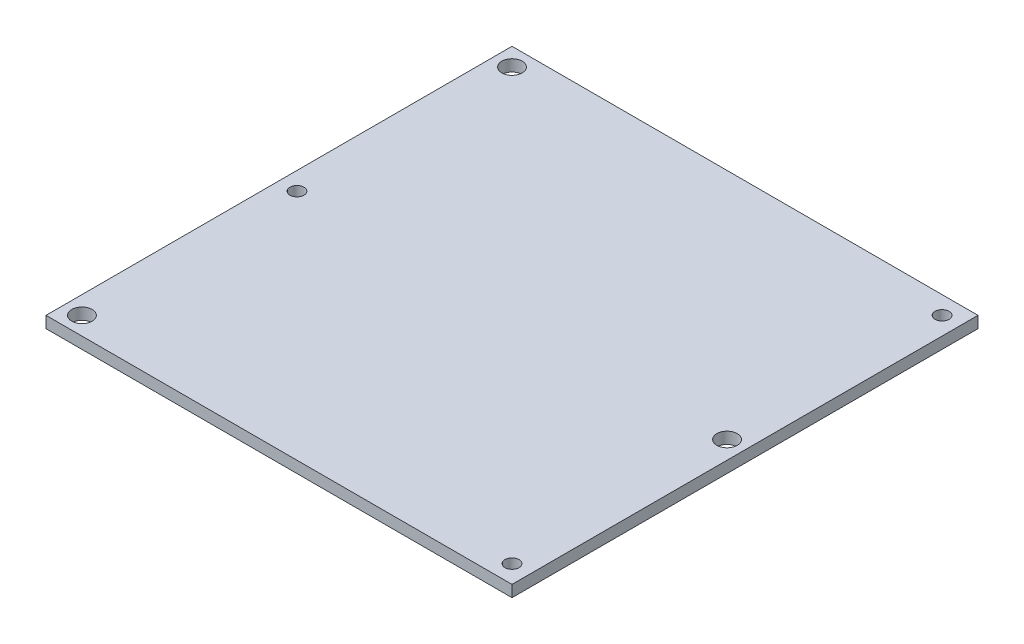
ISO-10303-21;
HEADER;
FILE_DESCRIPTION(('STEP AP214'),'2;1');
FILE_NAME('part.step','',(''),(''),'','','');
FILE_SCHEMA(('AUTOMOTIVE_DESIGN { 1 0 10303 214 1 1 1 1 }'));
ENDSEC;
DATA;
#1=APPLICATION_CONTEXT('core data for automotive mechanical design processes');
#2=APPLICATION_PROTOCOL_DEFINITION('international standard','automotive_design',2000,#1);
#3=PRODUCT_CONTEXT('',#1,'mechanical');
#4=PRODUCT('Part','Part','',(#3));
#5=PRODUCT_RELATED_PRODUCT_CATEGORY('part','',(#4));
#6=PRODUCT_DEFINITION_FORMATION('','',#4);
#7=PRODUCT_DEFINITION_CONTEXT('part definition',#1,'design');
#8=PRODUCT_DEFINITION('design','',#6,#7);
#9=PRODUCT_DEFINITION_SHAPE('','',#8);
#10=(LENGTH_UNIT() NAMED_UNIT(*) SI_UNIT(.MILLI.,.METRE.));
#11=(NAMED_UNIT(*) PLANE_ANGLE_UNIT() SI_UNIT($,.RADIAN.));
#12=(NAMED_UNIT(*) SI_UNIT($,.STERADIAN.) SOLID_ANGLE_UNIT());
#13=UNCERTAINTY_MEASURE_WITH_UNIT(LENGTH_MEASURE(1.E-05),#10,'distance_accuracy_value','');
#14=(GEOMETRIC_REPRESENTATION_CONTEXT(3) GLOBAL_UNCERTAINTY_ASSIGNED_CONTEXT((#13)) GLOBAL_UNIT_ASSIGNED_CONTEXT((#10,
#11,#12)) REPRESENTATION_CONTEXT('',''));
#15=CARTESIAN_POINT('',(0.,0.,0.));
#16=DIRECTION('',(0.,0.,1.));
#17=DIRECTION('',(1.,0.,0.));
#18=AXIS2_PLACEMENT_3D('',#15,#16,#17);
#19=CARTESIAN_POINT('',(-171.45,8.5,171.45));
#20=DIRECTION('',(1.,0.,0.));
#21=DIRECTION('',(0.,0.,-1.));
#22=AXIS2_PLACEMENT_3D('',#19,#20,#21);
#23=PLANE('',#22);
#24=DIRECTION('',(0.,0.,1.));
#25=VECTOR('',#24,1.);
#26=CARTESIAN_POINT('',(-171.45,0.,171.45));
#27=LINE('',#26,#25);
#28=CARTESIAN_POINT('',(-171.45,0.,-171.45));
#29=VERTEX_POINT('',#28);
#30=CARTESIAN_POINT('',(-171.45,0.,171.45));
#31=VERTEX_POINT('',#30);
#32=EDGE_CURVE('E101',#29,#31,#27,.T.);
#33=ORIENTED_EDGE('',*,*,#32,.T.);
#34=DIRECTION('',(0.,-1.,0.));
#35=VECTOR('',#34,1.);
#36=CARTESIAN_POINT('',(-171.45,8.5,171.45));
#37=LINE('',#36,#35);
#38=CARTESIAN_POINT('',(-171.45,8.5,171.45));
#39=VERTEX_POINT('',#38);
#40=EDGE_CURVE('E11',#39,#31,#37,.T.);
#41=ORIENTED_EDGE('',*,*,#40,.F.);
#42=DIRECTION('',(0.,0.,1.));
#43=VECTOR('',#42,1.);
#44=CARTESIAN_POINT('',(-171.45,8.5,171.45));
#45=LINE('',#44,#43);
#46=CARTESIAN_POINT('',(-171.45,8.5,-171.45));
#47=VERTEX_POINT('',#46);
#48=EDGE_CURVE('E88',#47,#39,#45,.T.);
#49=ORIENTED_EDGE('',*,*,#48,.F.);
#50=DIRECTION('',(0.,-1.,0.));
#51=VECTOR('',#50,1.);
#52=CARTESIAN_POINT('',(-171.45,8.5,-171.45));
#53=LINE('',#52,#51);
#54=EDGE_CURVE('E97',#47,#29,#53,.T.);
#55=ORIENTED_EDGE('',*,*,#54,.T.);
#56=EDGE_LOOP('',(#33,#41,#49,#55));
#57=FACE_BOUND('',#56,.T.);
#58=ADVANCED_FACE('F35',(#57),#23,.F.);
#59=CARTESIAN_POINT('',(171.45,8.5,171.45));
#60=DIRECTION('',(0.,0.,-1.));
#61=DIRECTION('',(-1.,0.,0.));
#62=AXIS2_PLACEMENT_3D('',#59,#60,#61);
#63=PLANE('',#62);
#64=DIRECTION('',(1.,0.,0.));
#65=VECTOR('',#64,1.);
#66=CARTESIAN_POINT('',(171.45,0.,171.45));
#67=LINE('',#66,#65);
#68=CARTESIAN_POINT('',(171.45,0.,171.45));
#69=VERTEX_POINT('',#68);
#70=EDGE_CURVE('E92',#31,#69,#67,.T.);
#71=ORIENTED_EDGE('',*,*,#70,.T.);
#72=DIRECTION('',(0.,-1.,0.));
#73=VECTOR('',#72,1.);
#74=CARTESIAN_POINT('',(171.45,8.5,171.45));
#75=LINE('',#74,#73);
#76=CARTESIAN_POINT('',(171.45,8.5,171.45));
#77=VERTEX_POINT('',#76);
#78=EDGE_CURVE('E44',#77,#69,#75,.T.);
#79=ORIENTED_EDGE('',*,*,#78,.F.);
#80=DIRECTION('',(1.,0.,0.));
#81=VECTOR('',#80,1.);
#82=CARTESIAN_POINT('',(171.45,8.5,171.45));
#83=LINE('',#82,#81);
#84=EDGE_CURVE('E83',#39,#77,#83,.T.);
#85=ORIENTED_EDGE('',*,*,#84,.F.);
#86=ORIENTED_EDGE('',*,*,#40,.T.);
#87=EDGE_LOOP('',(#71,#79,#85,#86));
#88=FACE_BOUND('',#87,.T.);
#89=ADVANCED_FACE('F91',(#88),#63,.F.);
#90=CARTESIAN_POINT('',(171.45,8.5,171.45));
#91=DIRECTION('',(-1.,0.,0.));
#92=DIRECTION('',(0.,0.,1.));
#93=AXIS2_PLACEMENT_3D('',#90,#91,#92);
#94=PLANE('',#93);
#95=DIRECTION('',(0.,0.,-1.));
#96=VECTOR('',#95,1.);
#97=CARTESIAN_POINT('',(171.45,0.,171.45));
#98=LINE('',#97,#96);
#99=CARTESIAN_POINT('',(171.45,0.,-171.45));
#100=VERTEX_POINT('',#99);
#101=EDGE_CURVE('E70',#69,#100,#98,.T.);
#102=ORIENTED_EDGE('',*,*,#101,.T.);
#103=DIRECTION('',(0.,-1.,0.));
#104=VECTOR('',#103,1.);
#105=CARTESIAN_POINT('',(171.45,8.5,-171.45));
#106=LINE('',#105,#104);
#107=CARTESIAN_POINT('',(171.45,8.5,-171.45));
#108=VERTEX_POINT('',#107);
#109=EDGE_CURVE('E93',#108,#100,#106,.T.);
#110=ORIENTED_EDGE('',*,*,#109,.F.);
#111=DIRECTION('',(0.,0.,-1.));
#112=VECTOR('',#111,1.);
#113=CARTESIAN_POINT('',(171.45,8.5,171.45));
#114=LINE('',#113,#112);
#115=EDGE_CURVE('E86',#77,#108,#114,.T.);
#116=ORIENTED_EDGE('',*,*,#115,.F.);
#117=ORIENTED_EDGE('',*,*,#78,.T.);
#118=EDGE_LOOP('',(#102,#110,#116,#117));
#119=FACE_BOUND('',#118,.T.);
#120=ADVANCED_FACE('F95',(#119),#94,.F.);
#121=CARTESIAN_POINT('',(171.45,8.5,-171.45));
#122=DIRECTION('',(0.,0.,1.));
#123=DIRECTION('',(1.,0.,0.));
#124=AXIS2_PLACEMENT_3D('',#121,#122,#123);
#125=PLANE('',#124);
#126=DIRECTION('',(-1.,0.,0.));
#127=VECTOR('',#126,1.);
#128=CARTESIAN_POINT('',(171.45,0.,-171.45));
#129=LINE('',#128,#127);
#130=EDGE_CURVE('E76',#100,#29,#129,.T.);
#131=ORIENTED_EDGE('',*,*,#130,.T.);
#132=ORIENTED_EDGE('',*,*,#54,.F.);
#133=DIRECTION('',(-1.,0.,0.));
#134=VECTOR('',#133,1.);
#135=CARTESIAN_POINT('',(171.45,8.5,-171.45));
#136=LINE('',#135,#134);
#137=EDGE_CURVE('E53',#108,#47,#136,.T.);
#138=ORIENTED_EDGE('',*,*,#137,.F.);
#139=ORIENTED_EDGE('',*,*,#109,.T.);
#140=EDGE_LOOP('',(#131,#132,#138,#139));
#141=FACE_BOUND('',#140,.T.);
#142=ADVANCED_FACE('F160',(#141),#125,.F.);
#143=CARTESIAN_POINT('',(0.,8.5,0.));
#144=DIRECTION('',(0.,1.,0.));
#145=DIRECTION('',(0.,0.,1.));
#146=AXIS2_PLACEMENT_3D('',#143,#144,#145);
#147=PLANE('',#146);
#148=CARTESIAN_POINT('',(-158.225,8.5,0.));
#149=DIRECTION('',(0.,1.,0.));
#150=DIRECTION('',(0.,0.,1.));
#151=AXIS2_PLACEMENT_3D('',#148,#149,#150);
#152=CIRCLE('',#151,5.14999999999998);
#153=CARTESIAN_POINT('',(-158.225,8.5,5.14999999999998));
#154=VERTEX_POINT('',#153);
#155=EDGE_CURVE('E250',#154,#154,#152,.T.);
#156=ORIENTED_EDGE('',*,*,#155,.F.);
#157=EDGE_LOOP('',(#156));
#158=FACE_BOUND('',#157,.T.);
#159=CARTESIAN_POINT('',(-158.225,8.5,158.225));
#160=DIRECTION('',(0.,1.,0.));
#161=DIRECTION('',(0.,0.,1.));
#162=AXIS2_PLACEMENT_3D('',#159,#160,#161);
#163=CIRCLE('',#162,7.50000000000001);
#164=CARTESIAN_POINT('',(-158.225,8.5,165.725));
#165=VERTEX_POINT('',#164);
#166=EDGE_CURVE('E246',#165,#165,#163,.T.);
#167=ORIENTED_EDGE('',*,*,#166,.F.);
#168=EDGE_LOOP('',(#167));
#169=FACE_BOUND('',#168,.T.);
#170=CARTESIAN_POINT('',(158.225,8.5,0.));
#171=DIRECTION('',(0.,1.,0.));
#172=DIRECTION('',(0.,0.,1.));
#173=AXIS2_PLACEMENT_3D('',#170,#171,#172);
#174=CIRCLE('',#173,7.50000000000001);
#175=CARTESIAN_POINT('',(158.225,8.5,7.50000000000001));
#176=VERTEX_POINT('',#175);
#177=EDGE_CURVE('E233',#176,#176,#174,.T.);
#178=ORIENTED_EDGE('',*,*,#177,.F.);
#179=EDGE_LOOP('',(#178));
#180=FACE_BOUND('',#179,.T.);
#181=CARTESIAN_POINT('',(158.225,8.5,-158.225));
#182=DIRECTION('',(0.,1.,0.));
#183=DIRECTION('',(0.,0.,1.));
#184=AXIS2_PLACEMENT_3D('',#181,#182,#183);
#185=CIRCLE('',#184,5.14999999999998);
#186=CARTESIAN_POINT('',(158.225,8.5,-153.075));
#187=VERTEX_POINT('',#186);
#188=EDGE_CURVE('E247',#187,#187,#185,.T.);
#189=ORIENTED_EDGE('',*,*,#188,.F.);
#190=EDGE_LOOP('',(#189));
#191=FACE_BOUND('',#190,.T.);
#192=CARTESIAN_POINT('',(158.225,8.5,158.225));
#193=DIRECTION('',(0.,1.,0.));
#194=DIRECTION('',(0.,0.,1.));
#195=AXIS2_PLACEMENT_3D('',#192,#193,#194);
#196=CIRCLE('',#195,5.14999999999998);
#197=CARTESIAN_POINT('',(158.225,8.5,163.375));
#198=VERTEX_POINT('',#197);
#199=EDGE_CURVE('E253',#198,#198,#196,.T.);
#200=ORIENTED_EDGE('',*,*,#199,.F.);
#201=EDGE_LOOP('',(#200));
#202=FACE_BOUND('',#201,.T.);
#203=CARTESIAN_POINT('',(-158.225,8.5,-158.225));
#204=DIRECTION('',(0.,1.,0.));
#205=DIRECTION('',(0.,0.,1.));
#206=AXIS2_PLACEMENT_3D('',#203,#204,#205);
#207=CIRCLE('',#206,7.50000000000001);
#208=CARTESIAN_POINT('',(-158.225,8.5,-150.725));
#209=VERTEX_POINT('',#208);
#210=EDGE_CURVE('E113',#209,#209,#207,.T.);
#211=ORIENTED_EDGE('',*,*,#210,.F.);
#212=EDGE_LOOP('',(#211));
#213=FACE_BOUND('',#212,.T.);
#214=ORIENTED_EDGE('',*,*,#48,.T.);
#215=ORIENTED_EDGE('',*,*,#84,.T.);
#216=ORIENTED_EDGE('',*,*,#115,.T.);
#217=ORIENTED_EDGE('',*,*,#137,.T.);
#218=EDGE_LOOP('',(#214,#215,#216,#217));
#219=FACE_BOUND('',#218,.T.);
#220=ADVANCED_FACE('F84',(#158,#169,#180,#191,#202,#213,#219),#147,.T.);
#221=CARTESIAN_POINT('',(0.,0.,0.));
#222=DIRECTION('',(0.,1.,0.));
#223=DIRECTION('',(0.,0.,1.));
#224=AXIS2_PLACEMENT_3D('',#221,#222,#223);
#225=PLANE('',#224);
#226=CARTESIAN_POINT('',(-158.225,0.,0.));
#227=DIRECTION('',(0.,1.,0.));
#228=DIRECTION('',(0.,0.,1.));
#229=AXIS2_PLACEMENT_3D('',#226,#227,#228);
#230=CIRCLE('',#229,5.14999999999998);
#231=CARTESIAN_POINT('',(-158.225,0.,5.14999999999998));
#232=VERTEX_POINT('',#231);
#233=EDGE_CURVE('E38',#232,#232,#230,.T.);
#234=ORIENTED_EDGE('',*,*,#233,.T.);
#235=EDGE_LOOP('',(#234));
#236=FACE_BOUND('',#235,.T.);
#237=CARTESIAN_POINT('',(-158.225,0.,158.225));
#238=DIRECTION('',(0.,1.,0.));
#239=DIRECTION('',(0.,0.,1.));
#240=AXIS2_PLACEMENT_3D('',#237,#238,#239);
#241=CIRCLE('',#240,7.50000000000001);
#242=CARTESIAN_POINT('',(-158.225,0.,165.725));
#243=VERTEX_POINT('',#242);
#244=EDGE_CURVE('E121',#243,#243,#241,.T.);
#245=ORIENTED_EDGE('',*,*,#244,.T.);
#246=EDGE_LOOP('',(#245));
#247=FACE_BOUND('',#246,.T.);
#248=CARTESIAN_POINT('',(158.225,0.,0.));
#249=DIRECTION('',(0.,1.,0.));
#250=DIRECTION('',(0.,0.,1.));
#251=AXIS2_PLACEMENT_3D('',#248,#249,#250);
#252=CIRCLE('',#251,7.50000000000001);
#253=CARTESIAN_POINT('',(158.225,0.,7.50000000000001));
#254=VERTEX_POINT('',#253);
#255=EDGE_CURVE('E119',#254,#254,#252,.T.);
#256=ORIENTED_EDGE('',*,*,#255,.T.);
#257=EDGE_LOOP('',(#256));
#258=FACE_BOUND('',#257,.T.);
#259=CARTESIAN_POINT('',(158.225,0.,-158.225));
#260=DIRECTION('',(0.,1.,0.));
#261=DIRECTION('',(0.,0.,1.));
#262=AXIS2_PLACEMENT_3D('',#259,#260,#261);
#263=CIRCLE('',#262,5.14999999999998);
#264=CARTESIAN_POINT('',(158.225,0.,-153.075));
#265=VERTEX_POINT('',#264);
#266=EDGE_CURVE('E116',#265,#265,#263,.T.);
#267=ORIENTED_EDGE('',*,*,#266,.T.);
#268=EDGE_LOOP('',(#267));
#269=FACE_BOUND('',#268,.T.);
#270=CARTESIAN_POINT('',(158.225,0.,158.225));
#271=DIRECTION('',(0.,1.,0.));
#272=DIRECTION('',(0.,0.,1.));
#273=AXIS2_PLACEMENT_3D('',#270,#271,#272);
#274=CIRCLE('',#273,5.14999999999998);
#275=CARTESIAN_POINT('',(158.225,0.,163.375));
#276=VERTEX_POINT('',#275);
#277=EDGE_CURVE('E112',#276,#276,#274,.T.);
#278=ORIENTED_EDGE('',*,*,#277,.T.);
#279=EDGE_LOOP('',(#278));
#280=FACE_BOUND('',#279,.T.);
#281=CARTESIAN_POINT('',(-158.225,0.,-158.225));
#282=DIRECTION('',(0.,1.,0.));
#283=DIRECTION('',(0.,0.,1.));
#284=AXIS2_PLACEMENT_3D('',#281,#282,#283);
#285=CIRCLE('',#284,7.50000000000001);
#286=CARTESIAN_POINT('',(-158.225,0.,-150.725));
#287=VERTEX_POINT('',#286);
#288=EDGE_CURVE('E109',#287,#287,#285,.T.);
#289=ORIENTED_EDGE('',*,*,#288,.T.);
#290=EDGE_LOOP('',(#289));
#291=FACE_BOUND('',#290,.T.);
#292=ORIENTED_EDGE('',*,*,#32,.F.);
#293=ORIENTED_EDGE('',*,*,#130,.F.);
#294=ORIENTED_EDGE('',*,*,#101,.F.);
#295=ORIENTED_EDGE('',*,*,#70,.F.);
#296=EDGE_LOOP('',(#292,#293,#294,#295));
#297=FACE_BOUND('',#296,.T.);
#298=ADVANCED_FACE('F128',(#236,#247,#258,#269,#280,#291,#297),#225,.F.);
#299=CARTESIAN_POINT('',(-158.225,-1.5,-158.225));
#300=DIRECTION('',(0.,1.,0.));
#301=DIRECTION('',(0.,0.,1.));
#302=AXIS2_PLACEMENT_3D('',#299,#300,#301);
#303=CYLINDRICAL_SURFACE('',#302,7.50000000000001);
#304=ORIENTED_EDGE('',*,*,#210,.T.);
#305=EDGE_LOOP('',(#304));
#306=FACE_BOUND('',#305,.T.);
#307=ORIENTED_EDGE('',*,*,#288,.F.);
#308=EDGE_LOOP('',(#307));
#309=FACE_BOUND('',#308,.T.);
#310=ADVANCED_FACE('F151',(#306,#309),#303,.F.);
#311=CARTESIAN_POINT('',(158.225,-1.5,158.225));
#312=DIRECTION('',(0.,1.,0.));
#313=DIRECTION('',(0.,0.,1.));
#314=AXIS2_PLACEMENT_3D('',#311,#312,#313);
#315=CYLINDRICAL_SURFACE('',#314,5.14999999999998);
#316=ORIENTED_EDGE('',*,*,#199,.T.);
#317=EDGE_LOOP('',(#316));
#318=FACE_BOUND('',#317,.T.);
#319=ORIENTED_EDGE('',*,*,#277,.F.);
#320=EDGE_LOOP('',(#319));
#321=FACE_BOUND('',#320,.T.);
#322=ADVANCED_FACE('F157',(#318,#321),#315,.F.);
#323=CARTESIAN_POINT('',(158.225,-1.5,-158.225));
#324=DIRECTION('',(0.,1.,0.));
#325=DIRECTION('',(0.,0.,1.));
#326=AXIS2_PLACEMENT_3D('',#323,#324,#325);
#327=CYLINDRICAL_SURFACE('',#326,5.14999999999998);
#328=ORIENTED_EDGE('',*,*,#188,.T.);
#329=EDGE_LOOP('',(#328));
#330=FACE_BOUND('',#329,.T.);
#331=ORIENTED_EDGE('',*,*,#266,.F.);
#332=EDGE_LOOP('',(#331));
#333=FACE_BOUND('',#332,.T.);
#334=ADVANCED_FACE('F198',(#330,#333),#327,.F.);
#335=CARTESIAN_POINT('',(158.225,-1.5,0.));
#336=DIRECTION('',(0.,1.,0.));
#337=DIRECTION('',(0.,0.,1.));
#338=AXIS2_PLACEMENT_3D('',#335,#336,#337);
#339=CYLINDRICAL_SURFACE('',#338,7.50000000000001);
#340=ORIENTED_EDGE('',*,*,#177,.T.);
#341=EDGE_LOOP('',(#340));
#342=FACE_BOUND('',#341,.T.);
#343=ORIENTED_EDGE('',*,*,#255,.F.);
#344=EDGE_LOOP('',(#343));
#345=FACE_BOUND('',#344,.T.);
#346=ADVANCED_FACE('F138',(#342,#345),#339,.F.);
#347=CARTESIAN_POINT('',(-158.225,-1.5,158.225));
#348=DIRECTION('',(0.,1.,0.));
#349=DIRECTION('',(0.,0.,1.));
#350=AXIS2_PLACEMENT_3D('',#347,#348,#349);
#351=CYLINDRICAL_SURFACE('',#350,7.50000000000001);
#352=ORIENTED_EDGE('',*,*,#166,.T.);
#353=EDGE_LOOP('',(#352));
#354=FACE_BOUND('',#353,.T.);
#355=ORIENTED_EDGE('',*,*,#244,.F.);
#356=EDGE_LOOP('',(#355));
#357=FACE_BOUND('',#356,.T.);
#358=ADVANCED_FACE('F132',(#354,#357),#351,.F.);
#359=CARTESIAN_POINT('',(-158.225,-1.5,0.));
#360=DIRECTION('',(0.,1.,0.));
#361=DIRECTION('',(0.,0.,1.));
#362=AXIS2_PLACEMENT_3D('',#359,#360,#361);
#363=CYLINDRICAL_SURFACE('',#362,5.14999999999998);
#364=ORIENTED_EDGE('',*,*,#155,.T.);
#365=EDGE_LOOP('',(#364));
#366=FACE_BOUND('',#365,.T.);
#367=ORIENTED_EDGE('',*,*,#233,.F.);
#368=EDGE_LOOP('',(#367));
#369=FACE_BOUND('',#368,.T.);
#370=ADVANCED_FACE('F130',(#366,#369),#363,.F.);
#371=CLOSED_SHELL('',(#58,#89,#120,#142,#220,#298,#310,#322,#334,#346,#358,#370));
#372=MANIFOLD_SOLID_BREP('B2',#371);
#373=ADVANCED_BREP_SHAPE_REPRESENTATION('',(#18,#372),#14);
#374=SHAPE_DEFINITION_REPRESENTATION(#9,#373);
ENDSEC;
END-ISO-10303-21;
